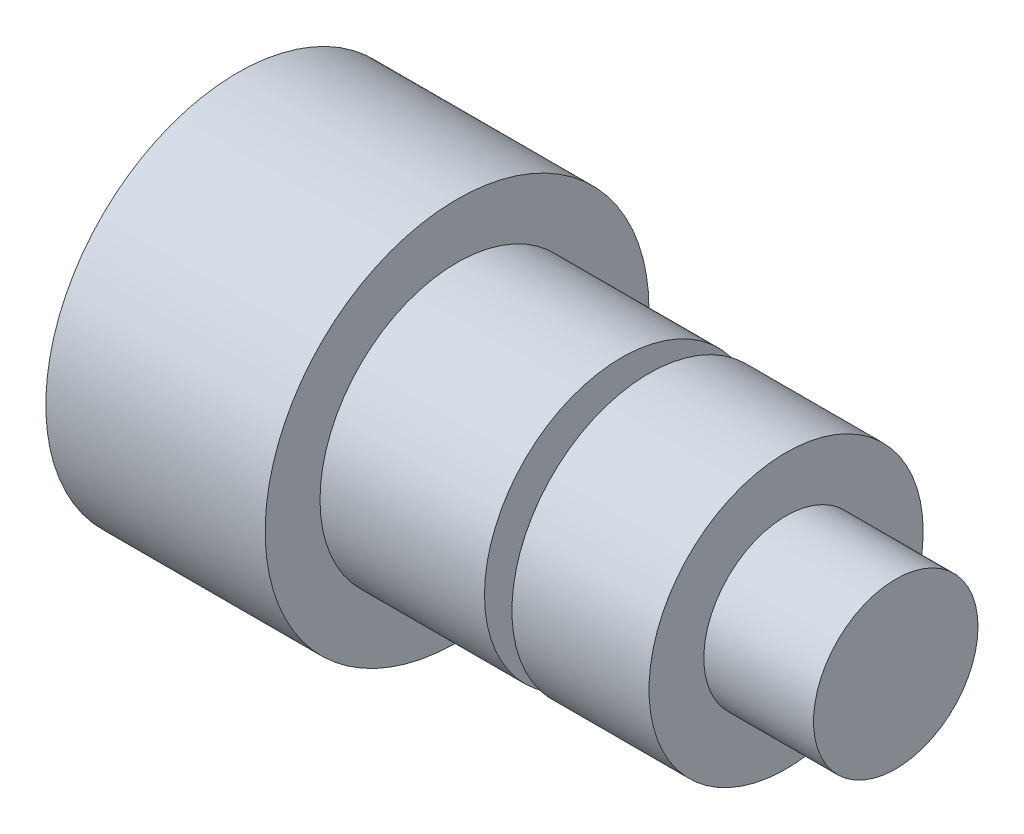
ISO-10303-21;
HEADER;
FILE_DESCRIPTION(('STEP AP214'),'2;1');
FILE_NAME('part.step','',(''),(''),'','','');
FILE_SCHEMA(('AUTOMOTIVE_DESIGN { 1 0 10303 214 1 1 1 1 }'));
ENDSEC;
DATA;
#1=APPLICATION_CONTEXT('core data for automotive mechanical design processes');
#2=APPLICATION_PROTOCOL_DEFINITION('international standard','automotive_design',2000,#1);
#3=PRODUCT_CONTEXT('',#1,'mechanical');
#4=PRODUCT('Part','Part','',(#3));
#5=PRODUCT_RELATED_PRODUCT_CATEGORY('part','',(#4));
#6=PRODUCT_DEFINITION_FORMATION('','',#4);
#7=PRODUCT_DEFINITION_CONTEXT('part definition',#1,'design');
#8=PRODUCT_DEFINITION('design','',#6,#7);
#9=PRODUCT_DEFINITION_SHAPE('','',#8);
#10=(LENGTH_UNIT() NAMED_UNIT(*) SI_UNIT(.MILLI.,.METRE.));
#11=(NAMED_UNIT(*) PLANE_ANGLE_UNIT() SI_UNIT($,.RADIAN.));
#12=(NAMED_UNIT(*) SI_UNIT($,.STERADIAN.) SOLID_ANGLE_UNIT());
#13=UNCERTAINTY_MEASURE_WITH_UNIT(LENGTH_MEASURE(1.E-05),#10,'distance_accuracy_value','');
#14=(GEOMETRIC_REPRESENTATION_CONTEXT(3) GLOBAL_UNCERTAINTY_ASSIGNED_CONTEXT((#13)) GLOBAL_UNIT_ASSIGNED_CONTEXT((#10,
#11,#12)) REPRESENTATION_CONTEXT('',''));
#15=CARTESIAN_POINT('',(0.,0.,0.));
#16=DIRECTION('',(0.,0.,1.));
#17=DIRECTION('',(1.,0.,0.));
#18=AXIS2_PLACEMENT_3D('',#15,#16,#17);
#19=CARTESIAN_POINT('',(127.,0.,0.));
#20=DIRECTION('',(1.,0.,0.));
#21=DIRECTION('',(0.,0.,-1.));
#22=AXIS2_PLACEMENT_3D('',#19,#20,#21);
#23=PLANE('',#22);
#24=CARTESIAN_POINT('',(127.,0.,0.));
#25=DIRECTION('',(1.,0.,0.));
#26=DIRECTION('',(0.,0.,-1.));
#27=AXIS2_PLACEMENT_3D('',#24,#25,#26);
#28=CIRCLE('',#27,31.75);
#29=CARTESIAN_POINT('',(127.,0.,-31.75));
#30=VERTEX_POINT('',#29);
#31=EDGE_CURVE('E52',#30,#30,#28,.T.);
#32=ORIENTED_EDGE('',*,*,#31,.T.);
#33=EDGE_LOOP('',(#32));
#34=FACE_BOUND('',#33,.T.);
#35=CARTESIAN_POINT('',(127.,0.,0.));
#36=DIRECTION('',(1.,0.,0.));
#37=DIRECTION('',(0.,0.,-1.));
#38=AXIS2_PLACEMENT_3D('',#35,#36,#37);
#39=CIRCLE('',#38,19.05);
#40=CARTESIAN_POINT('',(127.,0.,-19.05));
#41=VERTEX_POINT('',#40);
#42=EDGE_CURVE('E61',#41,#41,#39,.T.);
#43=ORIENTED_EDGE('',*,*,#42,.F.);
#44=EDGE_LOOP('',(#43));
#45=FACE_BOUND('',#44,.T.);
#46=ADVANCED_FACE('F30',(#34,#45),#23,.T.);
#47=CARTESIAN_POINT('',(88.9,0.,0.));
#48=DIRECTION('',(1.,0.,0.));
#49=DIRECTION('',(0.,0.,-1.));
#50=AXIS2_PLACEMENT_3D('',#47,#48,#49);
#51=PLANE('',#50);
#52=CARTESIAN_POINT('',(88.9,0.,0.));
#53=DIRECTION('',(1.,0.,0.));
#54=DIRECTION('',(0.,0.,-1.));
#55=AXIS2_PLACEMENT_3D('',#52,#53,#54);
#56=CIRCLE('',#55,31.75);
#57=CARTESIAN_POINT('',(88.9,0.,31.75));
#58=VERTEX_POINT('',#57);
#59=EDGE_CURVE('E41',#58,#58,#56,.T.);
#60=ORIENTED_EDGE('',*,*,#59,.T.);
#61=EDGE_LOOP('',(#60));
#62=FACE_BOUND('',#61,.T.);
#63=CARTESIAN_POINT('',(88.9,0.,0.));
#64=DIRECTION('',(1.,0.,0.));
#65=DIRECTION('',(0.,0.,-1.));
#66=AXIS2_PLACEMENT_3D('',#63,#64,#65);
#67=CIRCLE('',#66,22.225);
#68=CARTESIAN_POINT('',(88.9,0.,-22.225));
#69=VERTEX_POINT('',#68);
#70=EDGE_CURVE('E49',#69,#69,#67,.T.);
#71=ORIENTED_EDGE('',*,*,#70,.F.);
#72=EDGE_LOOP('',(#71));
#73=FACE_BOUND('',#72,.T.);
#74=ADVANCED_FACE('F77',(#62,#73),#51,.T.);
#75=CARTESIAN_POINT('',(50.8,0.,0.));
#76=DIRECTION('',(1.,0.,0.));
#77=DIRECTION('',(0.,0.,-1.));
#78=AXIS2_PLACEMENT_3D('',#75,#76,#77);
#79=PLANE('',#78);
#80=CARTESIAN_POINT('',(50.8,0.,0.));
#81=DIRECTION('',(1.,0.,0.));
#82=DIRECTION('',(0.,0.,-1.));
#83=AXIS2_PLACEMENT_3D('',#80,#81,#82);
#84=CIRCLE('',#83,44.45);
#85=CARTESIAN_POINT('',(50.8,0.,-44.45));
#86=VERTEX_POINT('',#85);
#87=EDGE_CURVE('E10',#86,#86,#84,.T.);
#88=ORIENTED_EDGE('',*,*,#87,.T.);
#89=EDGE_LOOP('',(#88));
#90=FACE_BOUND('',#89,.T.);
#91=CARTESIAN_POINT('',(50.8,0.,0.));
#92=DIRECTION('',(1.,0.,0.));
#93=DIRECTION('',(0.,0.,-1.));
#94=AXIS2_PLACEMENT_3D('',#91,#92,#93);
#95=CIRCLE('',#94,31.75);
#96=CARTESIAN_POINT('',(50.8,0.,31.75));
#97=VERTEX_POINT('',#96);
#98=EDGE_CURVE('E43',#97,#97,#95,.T.);
#99=ORIENTED_EDGE('',*,*,#98,.F.);
#100=EDGE_LOOP('',(#99));
#101=FACE_BOUND('',#100,.T.);
#102=ADVANCED_FACE('F83',(#90,#101),#79,.T.);
#103=CARTESIAN_POINT('',(50.8,0.,0.));
#104=DIRECTION('',(-1.,0.,0.));
#105=DIRECTION('',(0.,0.,1.));
#106=AXIS2_PLACEMENT_3D('',#103,#104,#105);
#107=CYLINDRICAL_SURFACE('',#106,44.45);
#108=ORIENTED_EDGE('',*,*,#87,.F.);
#109=EDGE_LOOP('',(#108));
#110=FACE_BOUND('',#109,.T.);
#111=CARTESIAN_POINT('',(0.,0.,0.));
#112=DIRECTION('',(1.,0.,0.));
#113=DIRECTION('',(0.,0.,-1.));
#114=AXIS2_PLACEMENT_3D('',#111,#112,#113);
#115=CIRCLE('',#114,44.45);
#116=CARTESIAN_POINT('',(0.,0.,-44.45));
#117=VERTEX_POINT('',#116);
#118=EDGE_CURVE('E34',#117,#117,#115,.T.);
#119=ORIENTED_EDGE('',*,*,#118,.T.);
#120=EDGE_LOOP('',(#119));
#121=FACE_BOUND('',#120,.T.);
#122=ADVANCED_FACE('F32',(#110,#121),#107,.T.);
#123=CARTESIAN_POINT('',(0.,0.,0.));
#124=DIRECTION('',(1.,0.,0.));
#125=DIRECTION('',(0.,0.,-1.));
#126=AXIS2_PLACEMENT_3D('',#123,#124,#125);
#127=PLANE('',#126);
#128=ORIENTED_EDGE('',*,*,#118,.F.);
#129=EDGE_LOOP('',(#128));
#130=FACE_BOUND('',#129,.T.);
#131=ADVANCED_FACE('F102',(#130),#127,.F.);
#132=CARTESIAN_POINT('',(88.9,0.,0.));
#133=DIRECTION('',(-1.,0.,0.));
#134=DIRECTION('',(0.,0.,1.));
#135=AXIS2_PLACEMENT_3D('',#132,#133,#134);
#136=CYLINDRICAL_SURFACE('',#135,31.75);
#137=CARTESIAN_POINT('',(88.9,0.,31.75));
#138=CARTESIAN_POINT('',(88.503125,0.,31.75));
#139=CARTESIAN_POINT('',(88.10625,0.,31.75));
#140=CARTESIAN_POINT('',(87.3125,0.,31.75));
#141=CARTESIAN_POINT('',(86.915625,0.,31.75));
#142=CARTESIAN_POINT('',(86.121875,0.,31.75));
#143=CARTESIAN_POINT('',(85.725,0.,31.75));
#144=CARTESIAN_POINT('',(84.93125,0.,31.75));
#145=CARTESIAN_POINT('',(84.534375,0.,31.75));
#146=CARTESIAN_POINT('',(83.740625,0.,31.75));
#147=CARTESIAN_POINT('',(83.34375,0.,31.75));
#148=CARTESIAN_POINT('',(82.55,0.,31.75));
#149=CARTESIAN_POINT('',(82.153125,0.,31.75));
#150=CARTESIAN_POINT('',(81.359375,0.,31.75));
#151=CARTESIAN_POINT('',(80.9625,0.,31.75));
#152=CARTESIAN_POINT('',(80.16875,0.,31.75));
#153=CARTESIAN_POINT('',(79.771875,0.,31.75));
#154=CARTESIAN_POINT('',(78.978125,0.,31.75));
#155=CARTESIAN_POINT('',(78.58125,0.,31.75));
#156=CARTESIAN_POINT('',(77.7875,0.,31.75));
#157=CARTESIAN_POINT('',(77.390625,0.,31.75));
#158=CARTESIAN_POINT('',(76.596875,0.,31.75));
#159=CARTESIAN_POINT('',(76.2,0.,31.75));
#160=CARTESIAN_POINT('',(75.40625,0.,31.75));
#161=CARTESIAN_POINT('',(75.009375,0.,31.75));
#162=CARTESIAN_POINT('',(74.215625,0.,31.75));
#163=CARTESIAN_POINT('',(73.81875,0.,31.75));
#164=CARTESIAN_POINT('',(73.025,0.,31.75));
#165=CARTESIAN_POINT('',(72.628125,0.,31.75));
#166=CARTESIAN_POINT('',(71.834375,0.,31.75));
#167=CARTESIAN_POINT('',(71.4375,0.,31.75));
#168=CARTESIAN_POINT('',(70.64375,0.,31.75));
#169=CARTESIAN_POINT('',(70.246875,0.,31.75));
#170=CARTESIAN_POINT('',(69.453125,0.,31.75));
#171=CARTESIAN_POINT('',(69.05625,0.,31.75));
#172=CARTESIAN_POINT('',(68.2625,0.,31.75));
#173=CARTESIAN_POINT('',(67.865625,0.,31.75));
#174=CARTESIAN_POINT('',(67.071875,0.,31.75));
#175=CARTESIAN_POINT('',(66.675,0.,31.75));
#176=CARTESIAN_POINT('',(65.88125,0.,31.75));
#177=CARTESIAN_POINT('',(65.484375,0.,31.75));
#178=CARTESIAN_POINT('',(64.690625,0.,31.75));
#179=CARTESIAN_POINT('',(64.29375,0.,31.75));
#180=CARTESIAN_POINT('',(63.5,0.,31.75));
#181=CARTESIAN_POINT('',(63.103125,0.,31.75));
#182=CARTESIAN_POINT('',(62.309375,0.,31.75));
#183=CARTESIAN_POINT('',(61.9125,0.,31.75));
#184=CARTESIAN_POINT('',(61.11875,0.,31.75));
#185=CARTESIAN_POINT('',(60.721875,0.,31.75));
#186=CARTESIAN_POINT('',(59.928125,0.,31.75));
#187=CARTESIAN_POINT('',(59.53125,0.,31.75));
#188=CARTESIAN_POINT('',(58.7375,0.,31.75));
#189=CARTESIAN_POINT('',(58.340625,0.,31.75));
#190=CARTESIAN_POINT('',(57.546875,0.,31.75));
#191=CARTESIAN_POINT('',(57.15,0.,31.75));
#192=CARTESIAN_POINT('',(56.35625,0.,31.75));
#193=CARTESIAN_POINT('',(55.959375,0.,31.75));
#194=CARTESIAN_POINT('',(55.165625,0.,31.75));
#195=CARTESIAN_POINT('',(54.76875,0.,31.75));
#196=CARTESIAN_POINT('',(53.975,0.,31.75));
#197=CARTESIAN_POINT('',(53.578125,0.,31.75));
#198=CARTESIAN_POINT('',(52.784375,0.,31.75));
#199=CARTESIAN_POINT('',(52.3875,0.,31.75));
#200=CARTESIAN_POINT('',(51.59375,0.,31.75));
#201=CARTESIAN_POINT('',(51.196875,0.,31.75));
#202=CARTESIAN_POINT('',(50.8,0.,31.75));
#203=B_SPLINE_CURVE_WITH_KNOTS('',3,(#137,#138,#139,#140,#141,#142,#143,#144,#145,#146,#147,
#148,#149,#150,#151,#152,#153,#154,#155,#156,#157,#158,#159,#160,#161,#162,#163,#164,#165,#166,
#167,#168,#169,#170,#171,#172,#173,#174,#175,#176,#177,#178,#179,#180,#181,#182,#183,#184,#185,
#186,#187,#188,#189,#190,#191,#192,#193,#194,#195,#196,#197,#198,#199,#200,#201,#202),
.UNSPECIFIED.,.F.,.F.,(4,2,2,2,2,2,2,2,2,2,2,2,2,2,2,2,2,2,2,2,2,2,2,2,2,2,2,2,2,2,2,2,4),(0.,
1.19062499999999,2.38124999999999,3.57187499999999,4.76249999999999,5.95312499999999,
7.14374999999999,8.33437499999999,9.52499999999999,10.715625,11.90625,13.096875,14.2875,
15.478125,16.66875,17.859375,19.05,20.240625,21.43125,22.621875,23.8125,25.003125,26.19375,
27.384375,28.575,29.765625,30.95625,32.146875,33.3375,34.528125,35.71875,36.909375,38.1),.UNSPECIFIED.);
#204=EDGE_CURVE('BSEAM97',#58,#97,#203,.T.);
#205=ORIENTED_EDGE('',*,*,#59,.F.);
#206=ORIENTED_EDGE('',*,*,#98,.T.);
#207=ORIENTED_EDGE('',*,*,#204,.T.);
#208=ORIENTED_EDGE('',*,*,#204,.F.);
#209=EDGE_LOOP('',(#205,#207,#206,#208));
#210=FACE_BOUND('',#209,.T.);
#211=ADVANCED_FACE('F97',(#210),#136,.T.);
#212=CARTESIAN_POINT('',(95.25,0.,0.));
#213=DIRECTION('',(-1.,0.,0.));
#214=DIRECTION('',(0.,0.,1.));
#215=AXIS2_PLACEMENT_3D('',#212,#213,#214);
#216=CYLINDRICAL_SURFACE('',#215,22.225);
#217=CARTESIAN_POINT('',(95.25,0.,0.));
#218=DIRECTION('',(1.,0.,0.));
#219=DIRECTION('',(0.,0.,-1.));
#220=AXIS2_PLACEMENT_3D('',#217,#218,#219);
#221=CIRCLE('',#220,22.225);
#222=CARTESIAN_POINT('',(95.25,0.,-22.225));
#223=VERTEX_POINT('',#222);
#224=EDGE_CURVE('E46',#223,#223,#221,.T.);
#225=ORIENTED_EDGE('',*,*,#224,.F.);
#226=EDGE_LOOP('',(#225));
#227=FACE_BOUND('',#226,.T.);
#228=ORIENTED_EDGE('',*,*,#70,.T.);
#229=EDGE_LOOP('',(#228));
#230=FACE_BOUND('',#229,.T.);
#231=ADVANCED_FACE('F91',(#227,#230),#216,.T.);
#232=CARTESIAN_POINT('',(95.25,0.,0.));
#233=DIRECTION('',(1.,0.,0.));
#234=DIRECTION('',(0.,0.,-1.));
#235=AXIS2_PLACEMENT_3D('',#232,#233,#234);
#236=PLANE('',#235);
#237=CARTESIAN_POINT('',(95.25,0.,0.));
#238=DIRECTION('',(1.,0.,0.));
#239=DIRECTION('',(0.,0.,-1.));
#240=AXIS2_PLACEMENT_3D('',#237,#238,#239);
#241=CIRCLE('',#240,31.75);
#242=CARTESIAN_POINT('',(95.25,0.,-31.75));
#243=VERTEX_POINT('',#242);
#244=EDGE_CURVE('E55',#243,#243,#241,.T.);
#245=ORIENTED_EDGE('',*,*,#244,.F.);
#246=EDGE_LOOP('',(#245));
#247=FACE_BOUND('',#246,.T.);
#248=ORIENTED_EDGE('',*,*,#224,.T.);
#249=EDGE_LOOP('',(#248));
#250=FACE_BOUND('',#249,.T.);
#251=ADVANCED_FACE('F88',(#247,#250),#236,.F.);
#252=CARTESIAN_POINT('',(127.,0.,0.));
#253=DIRECTION('',(-1.,0.,0.));
#254=DIRECTION('',(0.,0.,1.));
#255=AXIS2_PLACEMENT_3D('',#252,#253,#254);
#256=CYLINDRICAL_SURFACE('',#255,31.75);
#257=ORIENTED_EDGE('',*,*,#31,.F.);
#258=EDGE_LOOP('',(#257));
#259=FACE_BOUND('',#258,.T.);
#260=ORIENTED_EDGE('',*,*,#244,.T.);
#261=EDGE_LOOP('',(#260));
#262=FACE_BOUND('',#261,.T.);
#263=ADVANCED_FACE('F72',(#259,#262),#256,.T.);
#264=CARTESIAN_POINT('',(152.4,0.,0.));
#265=DIRECTION('',(-1.,0.,0.));
#266=DIRECTION('',(0.,0.,1.));
#267=AXIS2_PLACEMENT_3D('',#264,#265,#266);
#268=CYLINDRICAL_SURFACE('',#267,19.05);
#269=CARTESIAN_POINT('',(152.4,0.,0.));
#270=DIRECTION('',(1.,0.,0.));
#271=DIRECTION('',(0.,0.,-1.));
#272=AXIS2_PLACEMENT_3D('',#269,#270,#271);
#273=CIRCLE('',#272,19.05);
#274=CARTESIAN_POINT('',(152.4,0.,-19.05));
#275=VERTEX_POINT('',#274);
#276=EDGE_CURVE('E58',#275,#275,#273,.T.);
#277=ORIENTED_EDGE('',*,*,#276,.F.);
#278=EDGE_LOOP('',(#277));
#279=FACE_BOUND('',#278,.T.);
#280=ORIENTED_EDGE('',*,*,#42,.T.);
#281=EDGE_LOOP('',(#280));
#282=FACE_BOUND('',#281,.T.);
#283=ADVANCED_FACE('F69',(#279,#282),#268,.T.);
#284=CARTESIAN_POINT('',(152.4,0.,0.));
#285=DIRECTION('',(1.,0.,0.));
#286=DIRECTION('',(0.,0.,-1.));
#287=AXIS2_PLACEMENT_3D('',#284,#285,#286);
#288=PLANE('',#287);
#289=ORIENTED_EDGE('',*,*,#276,.T.);
#290=EDGE_LOOP('',(#289));
#291=FACE_BOUND('',#290,.T.);
#292=ADVANCED_FACE('F67',(#291),#288,.T.);
#293=CLOSED_SHELL('',(#46,#74,#102,#122,#131,#211,#231,#251,#263,#283,#292));
#294=MANIFOLD_SOLID_BREP('B2',#293);
#295=ADVANCED_BREP_SHAPE_REPRESENTATION('',(#18,#294),#14);
#296=SHAPE_DEFINITION_REPRESENTATION(#9,#295);
ENDSEC;
END-ISO-10303-21;
